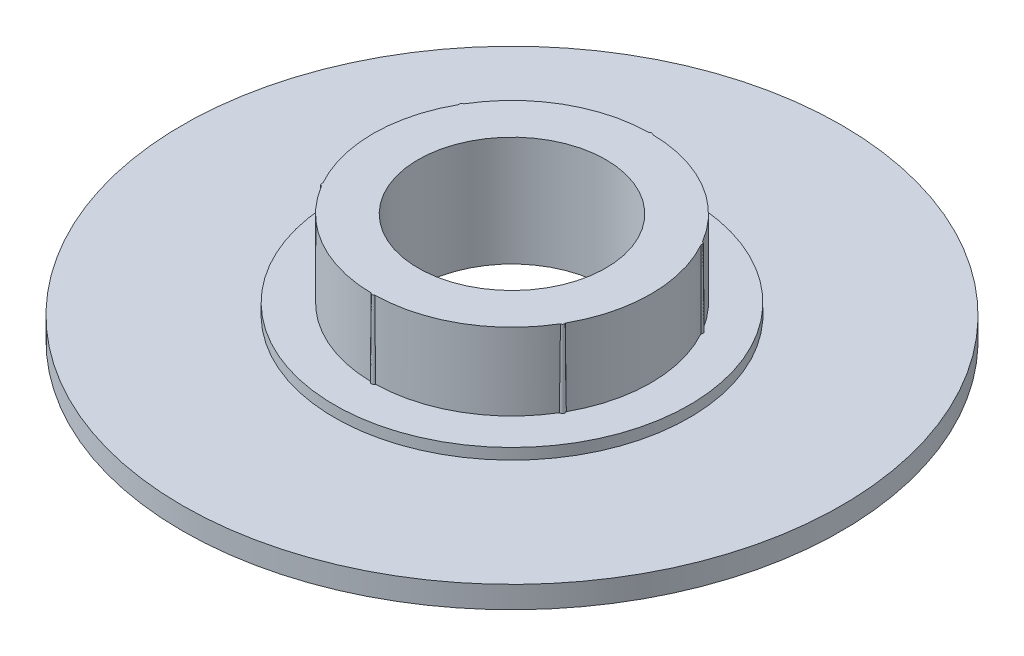
ISO-10303-21;
HEADER;
FILE_DESCRIPTION(('STEP AP214'),'2;1');
FILE_NAME('part.step','',(''),(''),'','','');
FILE_SCHEMA(('AUTOMOTIVE_DESIGN { 1 0 10303 214 1 1 1 1 }'));
ENDSEC;
DATA;
#1=APPLICATION_CONTEXT('core data for automotive mechanical design processes');
#2=APPLICATION_PROTOCOL_DEFINITION('international standard','automotive_design',2000,#1);
#3=PRODUCT_CONTEXT('',#1,'mechanical');
#4=PRODUCT('Part','Part','',(#3));
#5=PRODUCT_RELATED_PRODUCT_CATEGORY('part','',(#4));
#6=PRODUCT_DEFINITION_FORMATION('','',#4);
#7=PRODUCT_DEFINITION_CONTEXT('part definition',#1,'design');
#8=PRODUCT_DEFINITION('design','',#6,#7);
#9=PRODUCT_DEFINITION_SHAPE('','',#8);
#10=(LENGTH_UNIT() NAMED_UNIT(*) SI_UNIT(.MILLI.,.METRE.));
#11=(NAMED_UNIT(*) PLANE_ANGLE_UNIT() SI_UNIT($,.RADIAN.));
#12=(NAMED_UNIT(*) SI_UNIT($,.STERADIAN.) SOLID_ANGLE_UNIT());
#13=UNCERTAINTY_MEASURE_WITH_UNIT(LENGTH_MEASURE(1.E-05),#10,'distance_accuracy_value','');
#14=(GEOMETRIC_REPRESENTATION_CONTEXT(3) GLOBAL_UNCERTAINTY_ASSIGNED_CONTEXT((#13)) GLOBAL_UNIT_ASSIGNED_CONTEXT((#10,
#11,#12)) REPRESENTATION_CONTEXT('',''));
#15=CARTESIAN_POINT('',(0.,0.,0.));
#16=DIRECTION('',(0.,0.,1.));
#17=DIRECTION('',(1.,0.,0.));
#18=AXIS2_PLACEMENT_3D('',#15,#16,#17);
#19=CARTESIAN_POINT('',(0.,0.,0.));
#20=DIRECTION('',(0.,-1.,0.));
#21=DIRECTION('',(0.,0.,-1.));
#22=AXIS2_PLACEMENT_3D('',#19,#20,#21);
#23=CYLINDRICAL_SURFACE('',#22,12.65);
#24=CARTESIAN_POINT('',(-10.8740669110677,10.0352,-6.4635260356575));
#25=CARTESIAN_POINT('',(-10.8734088039186,9.91055791311937,-6.46463321713438));
#26=CARTESIAN_POINT('',(-10.8727527295285,9.78591578175658,-6.46573659492837));
#27=CARTESIAN_POINT('',(-10.8694818871115,9.16270491333508,-6.47123556405946));
#28=CARTESIAN_POINT('',(-10.8668957077355,8.66413555122413,-6.47557739579301));
#29=CARTESIAN_POINT('',(-10.8598745872821,7.29877372284312,-6.48734921772467));
#30=CARTESIAN_POINT('',(-10.8554849038926,6.43198027207595,-6.49469166627377));
#31=CARTESIAN_POINT('',(-10.8467962215786,4.69839139067121,-6.50919213638315));
#32=CARTESIAN_POINT('',(-10.8424972226518,3.83159596003371,-6.51635015794784));
#33=CARTESIAN_POINT('',(-10.8382212741763,2.9648,-6.52345457652554));
#34=B_SPLINE_CURVE_WITH_KNOTS('',3,(#24,#25,#26,#27,#28,#29,#30,#31,#32,#33),.UNSPECIFIED.,.F.,
.F.,(4,2,2,2,4),(0.,0.37394622465316,1.86973113303667,4.4702380923381,7.07074498930807),.UNSPECIFIED.);
#35=CARTESIAN_POINT('',(-10.8738811062021,10.,-6.46383861866782));
#36=VERTEX_POINT('',#35);
#37=CARTESIAN_POINT('',(-10.8383947861964,3.,-6.523166290886));
#38=VERTEX_POINT('',#37);
#39=EDGE_CURVE('E60',#36,#38,#34,.T.);
#40=ORIENTED_EDGE('',*,*,#39,.F.);
#41=CARTESIAN_POINT('',(0.,10.,0.));
#42=DIRECTION('',(0.,-1.,0.));
#43=DIRECTION('',(0.,0.,-1.));
#44=AXIS2_PLACEMENT_3D('',#41,#42,#43);
#45=CIRCLE('',#44,12.65);
#46=CARTESIAN_POINT('',(-0.160907896628059,10.,-12.6489765850365));
#47=VERTEX_POINT('',#46);
#48=EDGE_CURVE('E282',#36,#47,#45,.T.);
#49=ORIENTED_EDGE('',*,*,#48,.T.);
#50=CARTESIAN_POINT('',(-0.230366746616646,2.9648,-12.6479022435364));
#51=CARTESIAN_POINT('',(-0.228785813563986,3.13022028816024,-12.6479310358633));
#52=CARTESIAN_POINT('',(-0.227202452048972,3.29564055339049,-12.6479595791042));
#53=CARTESIAN_POINT('',(-0.219272169004735,4.1227417528096,-12.6481010498786));
#54=CARTESIAN_POINT('',(-0.212884821116562,4.78442230171624,-12.648210241121));
#55=CARTESIAN_POINT('',(-0.191531573793544,6.97580537420456,-12.6485586668718));
#56=CARTESIAN_POINT('',(-0.176304189440443,8.50550534609947,-12.6487805863279));
#57=CARTESIAN_POINT('',(-0.160544289368188,10.0352,-12.6489812052652));
#58=B_SPLINE_CURVE_WITH_KNOTS('',3,(#50,#51,#52,#53,#54,#55,#56,#57),.UNSPECIFIED.,.F.,.F.,(4,2,
2,4),(0.,0.496283535666299,2.48141768341761,7.0707449377615),.UNSPECIFIED.);
#59=CARTESIAN_POINT('',(-0.230030327919373,3.,-12.6479083665339));
#60=VERTEX_POINT('',#59);
#61=EDGE_CURVE('E265',#60,#47,#58,.T.);
#62=ORIENTED_EDGE('',*,*,#61,.F.);
#63=CARTESIAN_POINT('',(0.,3.,0.));
#64=DIRECTION('',(0.,-1.,0.));
#65=DIRECTION('',(0.,0.,-1.));
#66=AXIS2_PLACEMENT_3D('',#63,#64,#65);
#67=CIRCLE('',#66,12.65);
#68=EDGE_CURVE('E134',#38,#60,#67,.T.);
#69=ORIENTED_EDGE('',*,*,#68,.F.);
#70=EDGE_LOOP('',(#40,#49,#62,#69));
#71=FACE_BOUND('',#70,.T.);
#72=ADVANCED_FACE('F38',(#71),#23,.T.);
#73=CARTESIAN_POINT('',(-11.068588020793,2.9648,-6.12444766701114));
#74=CARTESIAN_POINT('',(-11.0678224891532,3.13022028816024,-6.12583119135987));
#75=CARTESIAN_POINT('',(-11.0670555275674,3.29564055339049,-6.1272166942757));
#76=CARTESIAN_POINT('',(-11.0632129033298,4.1227417528096,-6.13415525623843));
#77=CARTESIAN_POINT('',(-11.0601137917755,4.78442230171624,-6.13974145739359));
#78=CARTESIAN_POINT('',(-11.0497389136655,6.97580537420457,-6.15840812490399));
#79=CARTESIAN_POINT('',(-11.0423174093755,8.50550534609948,-6.171706386315));
#80=CARTESIAN_POINT('',(-11.0346112004356,10.0352,-6.18545516960735));
#81=B_SPLINE_CURVE_WITH_KNOTS('',3,(#73,#74,#75,#76,#77,#78,#79,#80),.UNSPECIFIED.,.F.,.F.,(4,2,
2,4),(0.,0.4962835356663,2.48141768341761,7.0707449377615),.UNSPECIFIED.);
#82=CARTESIAN_POINT('',(-11.0684251141157,3.,-6.12474207564809));
#83=VERTEX_POINT('',#82);
#84=CARTESIAN_POINT('',(-11.0347890028301,10.,-6.18513796636898));
#85=VERTEX_POINT('',#84);
#86=EDGE_CURVE('E137',#83,#85,#81,.T.);
#87=ORIENTED_EDGE('',*,*,#86,.F.);
#88=CARTESIAN_POINT('',(-11.0684251141158,3.,6.12474207564789));
#89=VERTEX_POINT('',#88);
#90=EDGE_CURVE('E125',#89,#83,#67,.T.);
#91=ORIENTED_EDGE('',*,*,#90,.F.);
#92=CARTESIAN_POINT('',(-11.0346112004354,10.0352,6.18545516960769));
#93=CARTESIAN_POINT('',(-11.0352409941464,9.91055791311937,6.18433164135969));
#94=CARTESIAN_POINT('',(-11.0358685101509,9.78591578175658,6.18321177537415));
#95=CARTESIAN_POINT('',(-11.0389953359045,9.16270491333508,6.17762965818366));
#96=CARTESIAN_POINT('',(-11.0414623827968,8.66413555122412,6.17321904527855));
#97=CARTESIAN_POINT('',(-11.0481465194117,7.29877372284312,6.16125266563701));
#98=CARTESIAN_POINT('',(-11.0523104246865,6.43198027207594,6.15377986403261));
#99=CARTESIAN_POINT('',(-11.060523859011,4.69839139067121,6.13900500936855));
#100=CARTESIAN_POINT('',(-11.0645733880635,3.8315959600337,6.13170295630481));
#101=CARTESIAN_POINT('',(-11.0685880207931,2.96479999999999,6.12444766701089));
#102=B_SPLINE_CURVE_WITH_KNOTS('',3,(#92,#93,#94,#95,#96,#97,#98,#99,#100,#101),.UNSPECIFIED.,
.F.,.F.,(4,2,2,2,4),(0.,0.37394622465316,1.86973113303667,4.47023809233811,7.07074498930807),.UNSPECIFIED.);
#103=CARTESIAN_POINT('',(-11.0347890028303,10.,6.18513796636875));
#104=VERTEX_POINT('',#103);
#105=EDGE_CURVE('E185',#104,#89,#102,.T.);
#106=ORIENTED_EDGE('',*,*,#105,.F.);
#107=EDGE_CURVE('E140',#104,#85,#45,.T.);
#108=ORIENTED_EDGE('',*,*,#107,.T.);
#109=EDGE_LOOP('',(#87,#91,#106,#108));
#110=FACE_BOUND('',#109,.T.);
#111=ADVANCED_FACE('F138',(#110),#23,.T.);
#112=CARTESIAN_POINT('',(-10.8382212741765,2.9648,6.52345457652529));
#113=CARTESIAN_POINT('',(-10.8390366755893,3.13022028816024,6.52209984450344));
#114=CARTESIAN_POINT('',(-10.8398530755185,3.29564055339049,6.52074288482852));
#115=CARTESIAN_POINT('',(-10.8439407343252,4.1227417528096,6.51394579364023));
#116=CARTESIAN_POINT('',(-10.8472289706591,4.78442230171625,6.50846878372745));
#117=CARTESIAN_POINT('',(-10.8582073398721,6.97580537420457,6.49015054196782));
#118=CARTESIAN_POINT('',(-10.8660132199352,8.50550534609947,6.47707420001289));
#119=CARTESIAN_POINT('',(-10.8740669110675,10.0352,6.46352603565787));
#120=B_SPLINE_CURVE_WITH_KNOTS('',3,(#112,#113,#114,#115,#116,#117,#118,#119),.UNSPECIFIED.,.F.,
.F.,(4,2,2,4),(0.,0.496283535666301,2.48141768341762,7.0707449377615),.UNSPECIFIED.);
#121=CARTESIAN_POINT('',(-10.8383947861965,3.,6.52316629088583));
#122=VERTEX_POINT('',#121);
#123=CARTESIAN_POINT('',(-10.8738811062022,10.,6.46383861866759));
#124=VERTEX_POINT('',#123);
#125=EDGE_CURVE('E178',#122,#124,#120,.T.);
#126=ORIENTED_EDGE('',*,*,#125,.F.);
#127=CARTESIAN_POINT('',(-0.23003032791934,3.,12.6479083665339));
#128=VERTEX_POINT('',#127);
#129=EDGE_CURVE('E133',#128,#122,#67,.T.);
#130=ORIENTED_EDGE('',*,*,#129,.F.);
#131=CARTESIAN_POINT('',(-0.160544289367603,10.0352,12.6489812052652));
#132=CARTESIAN_POINT('',(-0.161832190227746,9.91055791311938,12.648964858494));
#133=CARTESIAN_POINT('',(-0.163115780622331,9.78591578175658,12.6489483703025));
#134=CARTESIAN_POINT('',(-0.169513448793007,9.16270491333508,12.6488652222431));
#135=CARTESIAN_POINT('',(-0.174566675061212,8.66413555122413,12.6487964410715));
#136=CARTESIAN_POINT('',(-0.188271932129575,7.29877372284313,12.6486018833616));
#137=CARTESIAN_POINT('',(-0.196825520793814,6.43198027207595,12.6484715303064));
#138=CARTESIAN_POINT('',(-0.213727637432364,4.69839139067121,12.6481971457517));
#139=CARTESIAN_POINT('',(-0.22207616541159,3.8315959600337,12.6480531142526));
#140=CARTESIAN_POINT('',(-0.23036674661676,2.9648,12.6479022435364));
#141=B_SPLINE_CURVE_WITH_KNOTS('',3,(#131,#132,#133,#134,#135,#136,#137,#138,#139,#140),
.UNSPECIFIED.,.F.,.F.,(4,2,2,2,4),(0.,0.373946224653158,1.86973113303666,4.4702380923381,
7.07074498930807),.UNSPECIFIED.);
#142=CARTESIAN_POINT('',(-0.160907896628147,10.,12.6489765850365));
#143=VERTEX_POINT('',#142);
#144=EDGE_CURVE('E204',#143,#128,#141,.T.);
#145=ORIENTED_EDGE('',*,*,#144,.F.);
#146=EDGE_CURVE('E362',#143,#124,#45,.T.);
#147=ORIENTED_EDGE('',*,*,#146,.T.);
#148=EDGE_LOOP('',(#126,#130,#145,#147));
#149=FACE_BOUND('',#148,.T.);
#150=ADVANCED_FACE('F330',(#149),#23,.T.);
#151=CARTESIAN_POINT('',(0.230366746616558,2.9648,12.6479022435364));
#152=CARTESIAN_POINT('',(0.228785813563898,3.13022028816024,12.6479310358633));
#153=CARTESIAN_POINT('',(0.227202452048884,3.29564055339049,12.6479595791042));
#154=CARTESIAN_POINT('',(0.219272169004646,4.1227417528096,12.6481010498786));
#155=CARTESIAN_POINT('',(0.212884821116473,4.78442230171624,12.648210241121));
#156=CARTESIAN_POINT('',(0.191531573793456,6.97580537420456,12.6485586668718));
#157=CARTESIAN_POINT('',(0.176304189440357,8.50550534609947,12.6487805863279));
#158=CARTESIAN_POINT('',(0.1605442893681,10.0352,12.6489812052652));
#159=B_SPLINE_CURVE_WITH_KNOTS('',3,(#151,#152,#153,#154,#155,#156,#157,#158),.UNSPECIFIED.,.F.,
.F.,(4,2,2,4),(0.,0.496283535666299,2.48141768341761,7.0707449377615),.UNSPECIFIED.);
#160=CARTESIAN_POINT('',(0.230030327919223,3.,12.6479083665339));
#161=VERTEX_POINT('',#160);
#162=CARTESIAN_POINT('',(0.16090789662797,10.,12.6489765850365));
#163=VERTEX_POINT('',#162);
#164=EDGE_CURVE('E197',#161,#163,#159,.T.);
#165=ORIENTED_EDGE('',*,*,#164,.F.);
#166=CARTESIAN_POINT('',(10.8383947861964,3.,6.52316629088592));
#167=VERTEX_POINT('',#166);
#168=EDGE_CURVE('E357',#167,#161,#67,.T.);
#169=ORIENTED_EDGE('',*,*,#168,.F.);
#170=CARTESIAN_POINT('',(10.8740669110678,10.0352,6.46352603565742));
#171=CARTESIAN_POINT('',(10.8734088039186,9.91055791311937,6.4646332171343));
#172=CARTESIAN_POINT('',(10.8727527295286,9.78591578175658,6.46573659492829));
#173=CARTESIAN_POINT('',(10.8694818871115,9.16270491333508,6.47123556405938));
#174=CARTESIAN_POINT('',(10.8668957077356,8.66413555122413,6.47557739579294));
#175=CARTESIAN_POINT('',(10.8598745872821,7.29877372284312,6.48734921772459));
#176=CARTESIAN_POINT('',(10.8554849038926,6.43198027207594,6.4946916662737));
#177=CARTESIAN_POINT('',(10.8467962215786,4.69839139067121,6.50919213638307));
#178=CARTESIAN_POINT('',(10.8424972226519,3.8315959600337,6.51635015794776));
#179=CARTESIAN_POINT('',(10.8382212741764,2.9648,6.52345457652547));
#180=B_SPLINE_CURVE_WITH_KNOTS('',3,(#170,#171,#172,#173,#174,#175,#176,#177,#178,#179),
.UNSPECIFIED.,.F.,.F.,(4,2,2,2,4),(0.,0.37394622465316,1.86973113303667,4.47023809233811,
7.07074498930807),.UNSPECIFIED.);
#181=CARTESIAN_POINT('',(10.8738811062021,10.,6.46383861866774));
#182=VERTEX_POINT('',#181);
#183=EDGE_CURVE('E224',#182,#167,#180,.T.);
#184=ORIENTED_EDGE('',*,*,#183,.F.);
#185=EDGE_CURVE('E356',#182,#163,#45,.T.);
#186=ORIENTED_EDGE('',*,*,#185,.T.);
#187=EDGE_LOOP('',(#165,#169,#184,#186));
#188=FACE_BOUND('',#187,.T.);
#189=ADVANCED_FACE('F338',(#188),#23,.T.);
#190=CARTESIAN_POINT('',(11.068588020793,2.96479999999999,6.12444766701106));
#191=CARTESIAN_POINT('',(11.0678224891532,3.13022028816024,6.12583119135979));
#192=CARTESIAN_POINT('',(11.0670555275674,3.29564055339048,6.12721669427562));
#193=CARTESIAN_POINT('',(11.0632129033299,4.12274175280959,6.13415525623835));
#194=CARTESIAN_POINT('',(11.0601137917755,4.78442230171624,6.13974145739351));
#195=CARTESIAN_POINT('',(11.0497389136655,6.97580537420456,6.15840812490392));
#196=CARTESIAN_POINT('',(11.0423174093756,8.50550534609947,6.17170638631494));
#197=CARTESIAN_POINT('',(11.0346112004356,10.0352,6.18545516960728));
#198=B_SPLINE_CURVE_WITH_KNOTS('',3,(#190,#191,#192,#193,#194,#195,#196,#197),.UNSPECIFIED.,.F.,
.F.,(4,2,2,4),(0.,0.496283535666301,2.48141768341762,7.07074493776151),.UNSPECIFIED.);
#199=CARTESIAN_POINT('',(11.0684251141157,3.,6.12474207564801));
#200=VERTEX_POINT('',#199);
#201=CARTESIAN_POINT('',(11.0347890028302,10.,6.1851379663689));
#202=VERTEX_POINT('',#201);
#203=EDGE_CURVE('E217',#200,#202,#198,.T.);
#204=ORIENTED_EDGE('',*,*,#203,.F.);
#205=CARTESIAN_POINT('',(11.0684251141157,3.,-6.12474207564797));
#206=VERTEX_POINT('',#205);
#207=EDGE_CURVE('E288',#206,#200,#67,.T.);
#208=ORIENTED_EDGE('',*,*,#207,.F.);
#209=CARTESIAN_POINT('',(11.0346112004353,10.0352,-6.18545516960777));
#210=CARTESIAN_POINT('',(11.0352409941463,9.91055791311937,-6.18433164135977));
#211=CARTESIAN_POINT('',(11.0358685101509,9.78591578175658,-6.18321177537423));
#212=CARTESIAN_POINT('',(11.0389953359045,9.16270491333508,-6.17762965818374));
#213=CARTESIAN_POINT('',(11.0414623827967,8.66413555122412,-6.17321904527862));
#214=CARTESIAN_POINT('',(11.0481465194116,7.29877372284312,-6.16125266563708));
#215=CARTESIAN_POINT('',(11.0523104246864,6.43198027207594,-6.15377986403268));
#216=CARTESIAN_POINT('',(11.0605238590109,4.69839139067121,-6.13900500936863));
#217=CARTESIAN_POINT('',(11.0645733880634,3.8315959600337,-6.13170295630489));
#218=CARTESIAN_POINT('',(11.0685880207931,2.9648,-6.12444766701097));
#219=B_SPLINE_CURVE_WITH_KNOTS('',3,(#209,#210,#211,#212,#213,#214,#215,#216,#217,#218),
.UNSPECIFIED.,.F.,.F.,(4,2,2,2,4),(0.,0.37394622465316,1.86973113303667,4.47023809233811,
7.07074498930807),.UNSPECIFIED.);
#220=CARTESIAN_POINT('',(11.0347890028302,10.,-6.18513796636883));
#221=VERTEX_POINT('',#220);
#222=EDGE_CURVE('E252',#221,#206,#219,.T.);
#223=ORIENTED_EDGE('',*,*,#222,.F.);
#224=EDGE_CURVE('E284',#221,#202,#45,.T.);
#225=ORIENTED_EDGE('',*,*,#224,.T.);
#226=EDGE_LOOP('',(#204,#208,#223,#225));
#227=FACE_BOUND('',#226,.T.);
#228=ADVANCED_FACE('F331',(#227),#23,.T.);
#229=CARTESIAN_POINT('',(10.8382212741764,2.9648,-6.52345457652537));
#230=CARTESIAN_POINT('',(10.8390366755893,3.13022028816024,-6.52209984450352));
#231=CARTESIAN_POINT('',(10.8398530755185,3.29564055339049,-6.5207428848286));
#232=CARTESIAN_POINT('',(10.8439407343252,4.1227417528096,-6.5139457936403));
#233=CARTESIAN_POINT('',(10.847228970659,4.78442230171625,-6.50846878372753));
#234=CARTESIAN_POINT('',(10.858207339872,6.97580537420457,-6.49015054196789));
#235=CARTESIAN_POINT('',(10.8660132199352,8.50550534609948,-6.47707420001297));
#236=CARTESIAN_POINT('',(10.8740669110675,10.0352,-6.46352603565794));
#237=B_SPLINE_CURVE_WITH_KNOTS('',3,(#229,#230,#231,#232,#233,#234,#235,#236),.UNSPECIFIED.,.F.,
.F.,(4,2,2,4),(0.,0.496283535666302,2.48141768341762,7.0707449377615),.UNSPECIFIED.);
#238=CARTESIAN_POINT('',(10.8383947861965,3.,-6.52316629088591));
#239=VERTEX_POINT('',#238);
#240=CARTESIAN_POINT('',(10.8738811062022,10.,-6.46383861866767));
#241=VERTEX_POINT('',#240);
#242=EDGE_CURVE('E245',#239,#241,#237,.T.);
#243=ORIENTED_EDGE('',*,*,#242,.F.);
#244=CARTESIAN_POINT('',(0.230030327919322,3.,-12.6479083665339));
#245=VERTEX_POINT('',#244);
#246=EDGE_CURVE('E285',#245,#239,#67,.T.);
#247=ORIENTED_EDGE('',*,*,#246,.F.);
#248=CARTESIAN_POINT('',(0.160544289367515,10.0352,-12.6489812052652));
#249=CARTESIAN_POINT('',(0.161832190227658,9.91055791311937,-12.648964858494));
#250=CARTESIAN_POINT('',(0.163115780622243,9.78591578175658,-12.6489483703025));
#251=CARTESIAN_POINT('',(0.16951344879292,9.16270491333508,-12.6488652222431));
#252=CARTESIAN_POINT('',(0.174566675061124,8.66413555122413,-12.6487964410715));
#253=CARTESIAN_POINT('',(0.188271932129486,7.29877372284313,-12.6486018833616));
#254=CARTESIAN_POINT('',(0.196825520793726,6.43198027207595,-12.6484715303064));
#255=CARTESIAN_POINT('',(0.213727637432277,4.69839139067122,-12.6481971457517));
#256=CARTESIAN_POINT('',(0.222076165411503,3.83159596003371,-12.6480531142526));
#257=CARTESIAN_POINT('',(0.230366746616671,2.9648,-12.6479022435364));
#258=B_SPLINE_CURVE_WITH_KNOTS('',3,(#248,#249,#250,#251,#252,#253,#254,#255,#256,#257),
.UNSPECIFIED.,.F.,.F.,(4,2,2,2,4),(0.,0.373946224653158,1.86973113303666,4.4702380923381,
7.07074498930806),.UNSPECIFIED.);
#259=CARTESIAN_POINT('',(0.160907896628091,10.,-12.6489765850366));
#260=VERTEX_POINT('',#259);
#261=EDGE_CURVE('E272',#260,#245,#258,.T.);
#262=ORIENTED_EDGE('',*,*,#261,.F.);
#263=EDGE_CURVE('E283',#260,#241,#45,.T.);
#264=ORIENTED_EDGE('',*,*,#263,.T.);
#265=EDGE_LOOP('',(#243,#247,#262,#264));
#266=FACE_BOUND('',#265,.T.);
#267=ADVANCED_FACE('F326',(#266),#23,.T.);
#268=CARTESIAN_POINT('',(0.,0.,0.));
#269=DIRECTION('',(0.,-1.,0.));
#270=DIRECTION('',(0.,0.,-1.));
#271=AXIS2_PLACEMENT_3D('',#268,#269,#270);
#272=CYLINDRICAL_SURFACE('',#271,8.55);
#273=CARTESIAN_POINT('',(0.,10.,0.));
#274=DIRECTION('',(0.,-1.,0.));
#275=DIRECTION('',(0.,0.,-1.));
#276=AXIS2_PLACEMENT_3D('',#273,#274,#275);
#277=CIRCLE('',#276,8.55);
#278=CARTESIAN_POINT('',(0.,10.,-8.55));
#279=VERTEX_POINT('',#278);
#280=EDGE_CURVE('E279',#279,#279,#277,.T.);
#281=ORIENTED_EDGE('',*,*,#280,.F.);
#282=EDGE_LOOP('',(#281));
#283=FACE_BOUND('',#282,.T.);
#284=CARTESIAN_POINT('',(0.,0.,0.));
#285=DIRECTION('',(0.,-1.,0.));
#286=DIRECTION('',(0.,0.,-1.));
#287=AXIS2_PLACEMENT_3D('',#284,#285,#286);
#288=CIRCLE('',#287,8.55);
#289=CARTESIAN_POINT('',(0.,0.,-8.55));
#290=VERTEX_POINT('',#289);
#291=EDGE_CURVE('E11',#290,#290,#288,.T.);
#292=ORIENTED_EDGE('',*,*,#291,.T.);
#293=EDGE_LOOP('',(#292));
#294=FACE_BOUND('',#293,.T.);
#295=ADVANCED_FACE('F40',(#283,#294),#272,.F.);
#296=CARTESIAN_POINT('',(-8.55,0.,0.));
#297=DIRECTION('',(0.,1.,0.));
#298=DIRECTION('',(0.,0.,1.));
#299=AXIS2_PLACEMENT_3D('',#296,#297,#298);
#300=PLANE('',#299);
#301=ORIENTED_EDGE('',*,*,#291,.F.);
#302=EDGE_LOOP('',(#301));
#303=FACE_BOUND('',#302,.T.);
#304=CARTESIAN_POINT('',(0.,0.,0.));
#305=DIRECTION('',(0.,-1.,0.));
#306=DIRECTION('',(0.,0.,-1.));
#307=AXIS2_PLACEMENT_3D('',#304,#305,#306);
#308=CIRCLE('',#307,30.);
#309=CARTESIAN_POINT('',(0.,0.,-30.));
#310=VERTEX_POINT('',#309);
#311=EDGE_CURVE('E46',#310,#310,#308,.T.);
#312=ORIENTED_EDGE('',*,*,#311,.T.);
#313=EDGE_LOOP('',(#312));
#314=FACE_BOUND('',#313,.T.);
#315=ADVANCED_FACE('F299',(#303,#314),#300,.F.);
#316=CARTESIAN_POINT('',(0.,0.,0.));
#317=DIRECTION('',(0.,-1.,0.));
#318=DIRECTION('',(0.,0.,-1.));
#319=AXIS2_PLACEMENT_3D('',#316,#317,#318);
#320=CYLINDRICAL_SURFACE('',#319,30.);
#321=ORIENTED_EDGE('',*,*,#311,.F.);
#322=EDGE_LOOP('',(#321));
#323=FACE_BOUND('',#322,.T.);
#324=CARTESIAN_POINT('',(0.,2.,0.));
#325=DIRECTION('',(0.,-1.,0.));
#326=DIRECTION('',(0.,0.,-1.));
#327=AXIS2_PLACEMENT_3D('',#324,#325,#326);
#328=CIRCLE('',#327,30.);
#329=CARTESIAN_POINT('',(0.,2.,-30.));
#330=VERTEX_POINT('',#329);
#331=EDGE_CURVE('E294',#330,#330,#328,.T.);
#332=ORIENTED_EDGE('',*,*,#331,.T.);
#333=EDGE_LOOP('',(#332));
#334=FACE_BOUND('',#333,.T.);
#335=ADVANCED_FACE('F301',(#323,#334),#320,.T.);
#336=CARTESIAN_POINT('',(-30.,2.,0.));
#337=DIRECTION('',(0.,-1.,0.));
#338=DIRECTION('',(0.,0.,-1.));
#339=AXIS2_PLACEMENT_3D('',#336,#337,#338);
#340=PLANE('',#339);
#341=ORIENTED_EDGE('',*,*,#331,.F.);
#342=EDGE_LOOP('',(#341));
#343=FACE_BOUND('',#342,.T.);
#344=CARTESIAN_POINT('',(0.,2.,0.));
#345=DIRECTION('',(0.,-1.,0.));
#346=DIRECTION('',(0.,0.,-1.));
#347=AXIS2_PLACEMENT_3D('',#344,#345,#346);
#348=CIRCLE('',#347,16.15);
#349=CARTESIAN_POINT('',(0.,2.,-16.15));
#350=VERTEX_POINT('',#349);
#351=EDGE_CURVE('E291',#350,#350,#348,.T.);
#352=ORIENTED_EDGE('',*,*,#351,.T.);
#353=EDGE_LOOP('',(#352));
#354=FACE_BOUND('',#353,.T.);
#355=ADVANCED_FACE('F304',(#343,#354),#340,.F.);
#356=CARTESIAN_POINT('',(0.,0.,0.));
#357=DIRECTION('',(0.,-1.,0.));
#358=DIRECTION('',(0.,0.,-1.));
#359=AXIS2_PLACEMENT_3D('',#356,#357,#358);
#360=CYLINDRICAL_SURFACE('',#359,16.15);
#361=ORIENTED_EDGE('',*,*,#351,.F.);
#362=EDGE_LOOP('',(#361));
#363=FACE_BOUND('',#362,.T.);
#364=CARTESIAN_POINT('',(0.,3.,0.));
#365=DIRECTION('',(0.,-1.,0.));
#366=DIRECTION('',(0.,0.,-1.));
#367=AXIS2_PLACEMENT_3D('',#364,#365,#366);
#368=CIRCLE('',#367,16.15);
#369=CARTESIAN_POINT('',(0.,3.,-16.15));
#370=VERTEX_POINT('',#369);
#371=EDGE_CURVE('E287',#370,#370,#368,.T.);
#372=ORIENTED_EDGE('',*,*,#371,.T.);
#373=EDGE_LOOP('',(#372));
#374=FACE_BOUND('',#373,.T.);
#375=ADVANCED_FACE('F310',(#363,#374),#360,.T.);
#376=CARTESIAN_POINT('',(-16.15,3.,0.));
#377=DIRECTION('',(0.,-1.,0.));
#378=DIRECTION('',(0.,0.,-1.));
#379=AXIS2_PLACEMENT_3D('',#376,#377,#378);
#380=PLANE('',#379);
#381=CARTESIAN_POINT('',(-10.8686188174946,3.,-6.27500000000013));
#382=DIRECTION('',(0.,1.,0.));
#383=DIRECTION('',(0.,0.,1.));
#384=AXIS2_PLACEMENT_3D('',#381,#382,#383);
#385=CIRCLE('',#384,0.250000000000001);
#386=EDGE_CURVE('E53',#38,#83,#385,.T.);
#387=ORIENTED_EDGE('',*,*,#386,.F.);
#388=ORIENTED_EDGE('',*,*,#68,.T.);
#389=CARTESIAN_POINT('',(0.,3.,-12.55));
#390=DIRECTION('',(0.,1.,0.));
#391=DIRECTION('',(0.,0.,1.));
#392=AXIS2_PLACEMENT_3D('',#389,#390,#391);
#393=CIRCLE('',#392,0.25);
#394=EDGE_CURVE('E259',#245,#60,#393,.T.);
#395=ORIENTED_EDGE('',*,*,#394,.F.);
#396=ORIENTED_EDGE('',*,*,#246,.T.);
#397=CARTESIAN_POINT('',(10.8686188174947,3.,-6.27499999999998));
#398=DIRECTION('',(0.,1.,0.));
#399=DIRECTION('',(0.,0.,1.));
#400=AXIS2_PLACEMENT_3D('',#397,#398,#399);
#401=CIRCLE('',#400,0.250000000000001);
#402=EDGE_CURVE('E347',#206,#239,#401,.T.);
#403=ORIENTED_EDGE('',*,*,#402,.F.);
#404=ORIENTED_EDGE('',*,*,#207,.T.);
#405=CARTESIAN_POINT('',(10.8686188174947,3.,6.27500000000005));
#406=DIRECTION('',(0.,1.,0.));
#407=DIRECTION('',(0.,0.,1.));
#408=AXIS2_PLACEMENT_3D('',#405,#406,#407);
#409=CIRCLE('',#408,0.250000000000001);
#410=EDGE_CURVE('E214',#167,#200,#409,.T.);
#411=ORIENTED_EDGE('',*,*,#410,.F.);
#412=ORIENTED_EDGE('',*,*,#168,.T.);
#413=CARTESIAN_POINT('',(0.,3.,12.55));
#414=DIRECTION('',(0.,1.,0.));
#415=DIRECTION('',(0.,0.,1.));
#416=AXIS2_PLACEMENT_3D('',#413,#414,#415);
#417=CIRCLE('',#416,0.25);
#418=EDGE_CURVE('E194',#128,#161,#417,.T.);
#419=ORIENTED_EDGE('',*,*,#418,.F.);
#420=ORIENTED_EDGE('',*,*,#129,.T.);
#421=CARTESIAN_POINT('',(-10.8686188174948,3.,6.2749999999999));
#422=DIRECTION('',(0.,1.,0.));
#423=DIRECTION('',(0.,0.,1.));
#424=AXIS2_PLACEMENT_3D('',#421,#422,#423);
#425=CIRCLE('',#424,0.250000000000001);
#426=EDGE_CURVE('E130',#89,#122,#425,.T.);
#427=ORIENTED_EDGE('',*,*,#426,.F.);
#428=ORIENTED_EDGE('',*,*,#90,.T.);
#429=EDGE_LOOP('',(#387,#388,#395,#396,#403,#404,#411,#412,#419,#420,#427,#428));
#430=FACE_BOUND('',#429,.T.);
#431=ORIENTED_EDGE('',*,*,#371,.F.);
#432=EDGE_LOOP('',(#431));
#433=FACE_BOUND('',#432,.T.);
#434=ADVANCED_FACE('F127',(#430,#433),#380,.F.);
#435=CARTESIAN_POINT('',(-12.65,10.,0.));
#436=DIRECTION('',(0.,-1.,0.));
#437=DIRECTION('',(0.,0.,-1.));
#438=AXIS2_PLACEMENT_3D('',#435,#436,#437);
#439=PLANE('',#438);
#440=ORIENTED_EDGE('',*,*,#48,.F.);
#441=CARTESIAN_POINT('',(-10.8686188174946,10.,-6.27500000000013));
#442=DIRECTION('',(0.,-1.,0.));
#443=DIRECTION('',(0.,0.,-1.));
#444=AXIS2_PLACEMENT_3D('',#441,#442,#443);
#445=CIRCLE('',#444,0.188911925464689);
#446=EDGE_CURVE('E146',#85,#36,#445,.T.);
#447=ORIENTED_EDGE('',*,*,#446,.F.);
#448=ORIENTED_EDGE('',*,*,#107,.F.);
#449=CARTESIAN_POINT('',(-10.8686188174948,10.,6.2749999999999));
#450=DIRECTION('',(0.,-1.,0.));
#451=DIRECTION('',(0.,0.,-1.));
#452=AXIS2_PLACEMENT_3D('',#449,#450,#451);
#453=CIRCLE('',#452,0.18891192546469);
#454=EDGE_CURVE('E373',#124,#104,#453,.T.);
#455=ORIENTED_EDGE('',*,*,#454,.F.);
#456=ORIENTED_EDGE('',*,*,#146,.F.);
#457=CARTESIAN_POINT('',(0.,10.,12.55));
#458=DIRECTION('',(0.,-1.,0.));
#459=DIRECTION('',(0.,0.,-1.));
#460=AXIS2_PLACEMENT_3D('',#457,#458,#459);
#461=CIRCLE('',#460,0.188911925464688);
#462=EDGE_CURVE('E191',#163,#143,#461,.T.);
#463=ORIENTED_EDGE('',*,*,#462,.F.);
#464=ORIENTED_EDGE('',*,*,#185,.F.);
#465=CARTESIAN_POINT('',(10.8686188174947,10.,6.27500000000005));
#466=DIRECTION('',(0.,-1.,0.));
#467=DIRECTION('',(0.,0.,-1.));
#468=AXIS2_PLACEMENT_3D('',#465,#466,#467);
#469=CIRCLE('',#468,0.188911925464689);
#470=EDGE_CURVE('E211',#202,#182,#469,.T.);
#471=ORIENTED_EDGE('',*,*,#470,.F.);
#472=ORIENTED_EDGE('',*,*,#224,.F.);
#473=CARTESIAN_POINT('',(10.8686188174947,10.,-6.27499999999998));
#474=DIRECTION('',(0.,-1.,0.));
#475=DIRECTION('',(0.,0.,-1.));
#476=AXIS2_PLACEMENT_3D('',#473,#474,#475);
#477=CIRCLE('',#476,0.18891192546469);
#478=EDGE_CURVE('E349',#241,#221,#477,.T.);
#479=ORIENTED_EDGE('',*,*,#478,.F.);
#480=ORIENTED_EDGE('',*,*,#263,.F.);
#481=CARTESIAN_POINT('',(0.,10.,-12.55));
#482=DIRECTION('',(0.,-1.,0.));
#483=DIRECTION('',(0.,0.,-1.));
#484=AXIS2_PLACEMENT_3D('',#481,#482,#483);
#485=CIRCLE('',#484,0.188911925464688);
#486=EDGE_CURVE('E262',#47,#260,#485,.T.);
#487=ORIENTED_EDGE('',*,*,#486,.F.);
#488=EDGE_LOOP('',(#440,#447,#448,#455,#456,#463,#464,#471,#472,#479,#480,#487));
#489=FACE_BOUND('',#488,.T.);
#490=ORIENTED_EDGE('',*,*,#280,.T.);
#491=EDGE_LOOP('',(#490));
#492=FACE_BOUND('',#491,.T.);
#493=ADVANCED_FACE('F319',(#489,#492),#439,.F.);
#494=CARTESIAN_POINT('',(0.,3.,-12.55));
#495=DIRECTION('',(0.,-1.,0.));
#496=DIRECTION('',(0.,0.,1.));
#497=AXIS2_PLACEMENT_3D('',#494,#495,#496);
#498=CONICAL_SURFACE('',#497,0.25,0.00872664625997167);
#499=ORIENTED_EDGE('',*,*,#486,.T.);
#500=ORIENTED_EDGE('',*,*,#261,.T.);
#501=ORIENTED_EDGE('',*,*,#394,.T.);
#502=ORIENTED_EDGE('',*,*,#61,.T.);
#503=EDGE_LOOP('',(#499,#500,#501,#502));
#504=FACE_BOUND('',#503,.T.);
#505=ADVANCED_FACE('F240',(#504),#498,.T.);
#506=CARTESIAN_POINT('',(10.8686188174947,3.,-6.27499999999998));
#507=DIRECTION('',(0.,-1.,0.));
#508=DIRECTION('',(0.,0.,1.));
#509=AXIS2_PLACEMENT_3D('',#506,#507,#508);
#510=CONICAL_SURFACE('',#509,0.250000000000001,0.00872664625997167);
#511=ORIENTED_EDGE('',*,*,#478,.T.);
#512=ORIENTED_EDGE('',*,*,#222,.T.);
#513=ORIENTED_EDGE('',*,*,#402,.T.);
#514=ORIENTED_EDGE('',*,*,#242,.T.);
#515=EDGE_LOOP('',(#511,#512,#513,#514));
#516=FACE_BOUND('',#515,.T.);
#517=ADVANCED_FACE('F234',(#516),#510,.T.);
#518=CARTESIAN_POINT('',(10.8686188174947,3.,6.27500000000005));
#519=DIRECTION('',(0.,-1.,0.));
#520=DIRECTION('',(0.,0.,1.));
#521=AXIS2_PLACEMENT_3D('',#518,#519,#520);
#522=CONICAL_SURFACE('',#521,0.250000000000001,0.00872664625997167);
#523=ORIENTED_EDGE('',*,*,#470,.T.);
#524=ORIENTED_EDGE('',*,*,#183,.T.);
#525=ORIENTED_EDGE('',*,*,#410,.T.);
#526=ORIENTED_EDGE('',*,*,#203,.T.);
#527=EDGE_LOOP('',(#523,#524,#525,#526));
#528=FACE_BOUND('',#527,.T.);
#529=ADVANCED_FACE('F230',(#528),#522,.T.);
#530=CARTESIAN_POINT('',(0.,3.,12.55));
#531=DIRECTION('',(0.,-1.,0.));
#532=DIRECTION('',(0.,0.,1.));
#533=AXIS2_PLACEMENT_3D('',#530,#531,#532);
#534=CONICAL_SURFACE('',#533,0.25,0.00872664625997167);
#535=ORIENTED_EDGE('',*,*,#462,.T.);
#536=ORIENTED_EDGE('',*,*,#144,.T.);
#537=ORIENTED_EDGE('',*,*,#418,.T.);
#538=ORIENTED_EDGE('',*,*,#164,.T.);
#539=EDGE_LOOP('',(#535,#536,#537,#538));
#540=FACE_BOUND('',#539,.T.);
#541=ADVANCED_FACE('F172',(#540),#534,.T.);
#542=CARTESIAN_POINT('',(-10.8686188174948,3.,6.2749999999999));
#543=DIRECTION('',(0.,-1.,0.));
#544=DIRECTION('',(0.,0.,1.));
#545=AXIS2_PLACEMENT_3D('',#542,#543,#544);
#546=CONICAL_SURFACE('',#545,0.250000000000001,0.00872664625997167);
#547=ORIENTED_EDGE('',*,*,#454,.T.);
#548=ORIENTED_EDGE('',*,*,#105,.T.);
#549=ORIENTED_EDGE('',*,*,#426,.T.);
#550=ORIENTED_EDGE('',*,*,#125,.T.);
#551=EDGE_LOOP('',(#547,#548,#549,#550));
#552=FACE_BOUND('',#551,.T.);
#553=ADVANCED_FACE('F167',(#552),#546,.T.);
#554=CARTESIAN_POINT('',(-10.8686188174946,3.,-6.27500000000013));
#555=DIRECTION('',(0.,-1.,0.));
#556=DIRECTION('',(0.,0.,1.));
#557=AXIS2_PLACEMENT_3D('',#554,#555,#556);
#558=CONICAL_SURFACE('',#557,0.250000000000001,0.00872664625997167);
#559=ORIENTED_EDGE('',*,*,#446,.T.);
#560=ORIENTED_EDGE('',*,*,#39,.T.);
#561=ORIENTED_EDGE('',*,*,#386,.T.);
#562=ORIENTED_EDGE('',*,*,#86,.T.);
#563=EDGE_LOOP('',(#559,#560,#561,#562));
#564=FACE_BOUND('',#563,.T.);
#565=ADVANCED_FACE('F145',(#564),#558,.T.);
#566=CLOSED_SHELL('',(#72,#111,#150,#189,#228,#267,#295,#315,#335,#355,#375,#434,#493,#505,#517,
#529,#541,#553,#565));
#567=MANIFOLD_SOLID_BREP('B2',#566);
#568=ADVANCED_BREP_SHAPE_REPRESENTATION('',(#18,#567),#14);
#569=SHAPE_DEFINITION_REPRESENTATION(#9,#568);
ENDSEC;
END-ISO-10303-21;
